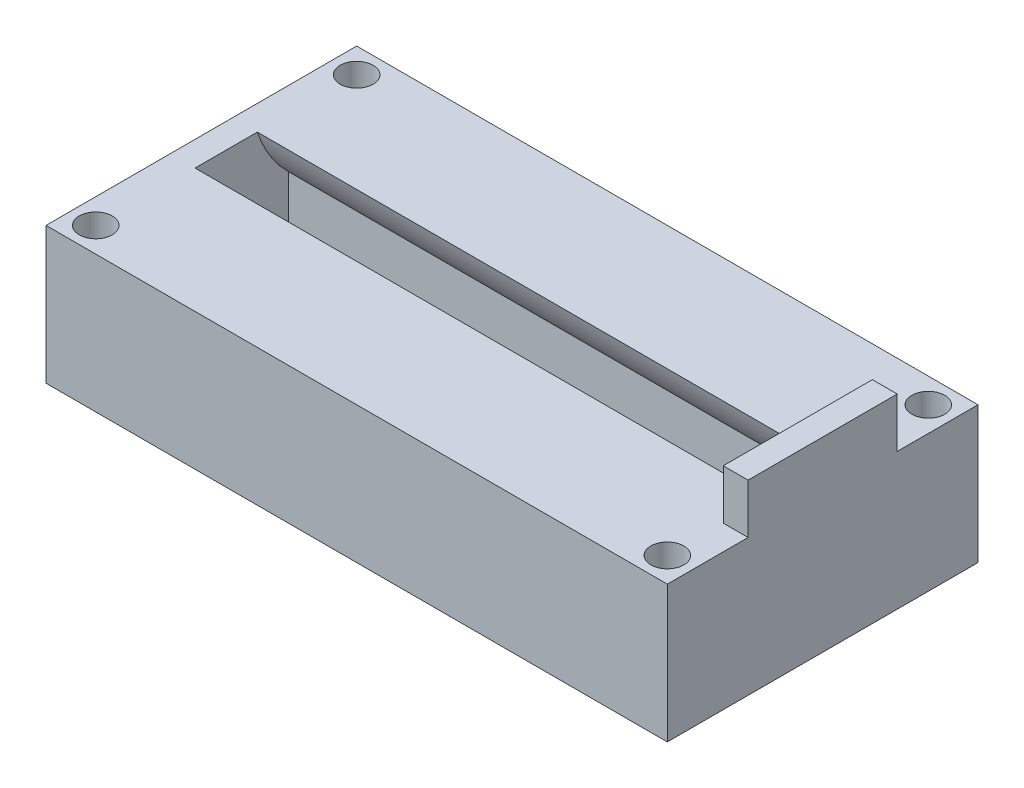
ISO-10303-21;
HEADER;
FILE_DESCRIPTION(('STEP AP214'),'2;1');
FILE_NAME('part.step','',(''),(''),'','','');
FILE_SCHEMA(('AUTOMOTIVE_DESIGN { 1 0 10303 214 1 1 1 1 }'));
ENDSEC;
DATA;
#1=APPLICATION_CONTEXT('core data for automotive mechanical design processes');
#2=APPLICATION_PROTOCOL_DEFINITION('international standard','automotive_design',2000,#1);
#3=PRODUCT_CONTEXT('',#1,'mechanical');
#4=PRODUCT('Part','Part','',(#3));
#5=PRODUCT_RELATED_PRODUCT_CATEGORY('part','',(#4));
#6=PRODUCT_DEFINITION_FORMATION('','',#4);
#7=PRODUCT_DEFINITION_CONTEXT('part definition',#1,'design');
#8=PRODUCT_DEFINITION('design','',#6,#7);
#9=PRODUCT_DEFINITION_SHAPE('','',#8);
#10=(LENGTH_UNIT() NAMED_UNIT(*) SI_UNIT(.MILLI.,.METRE.));
#11=(NAMED_UNIT(*) PLANE_ANGLE_UNIT() SI_UNIT($,.RADIAN.));
#12=(NAMED_UNIT(*) SI_UNIT($,.STERADIAN.) SOLID_ANGLE_UNIT());
#13=UNCERTAINTY_MEASURE_WITH_UNIT(LENGTH_MEASURE(1.E-05),#10,'distance_accuracy_value','');
#14=(GEOMETRIC_REPRESENTATION_CONTEXT(3) GLOBAL_UNCERTAINTY_ASSIGNED_CONTEXT((#13)) GLOBAL_UNIT_ASSIGNED_CONTEXT((#10,
#11,#12)) REPRESENTATION_CONTEXT('',''));
#15=CARTESIAN_POINT('',(0.,0.,0.));
#16=DIRECTION('',(0.,0.,1.));
#17=DIRECTION('',(1.,0.,0.));
#18=AXIS2_PLACEMENT_3D('',#15,#16,#17);
#19=CARTESIAN_POINT('',(0.,0.,0.));
#20=DIRECTION('',(0.,-1.,0.));
#21=DIRECTION('',(0.,0.,-1.));
#22=AXIS2_PLACEMENT_3D('',#19,#20,#21);
#23=PLANE('',#22);
#24=CARTESIAN_POINT('',(20.5,0.,-21.));
#25=DIRECTION('',(0.,-1.,0.));
#26=DIRECTION('',(0.,0.,-1.));
#27=AXIS2_PLACEMENT_3D('',#24,#25,#26);
#28=CIRCLE('',#27,2.);
#29=CARTESIAN_POINT('',(20.5,0.,-19.));
#30=VERTEX_POINT('',#29);
#31=CARTESIAN_POINT('',(20.5,0.,-23.));
#32=VERTEX_POINT('',#31);
#33=EDGE_CURVE('E55',#30,#32,#28,.T.);
#34=ORIENTED_EDGE('',*,*,#33,.F.);
#35=DIRECTION('',(-1.,0.,0.));
#36=VECTOR('',#35,1.);
#37=CARTESIAN_POINT('',(20.5,0.,-19.));
#38=LINE('',#37,#36);
#39=CARTESIAN_POINT('',(29.5,0.,-19.));
#40=VERTEX_POINT('',#39);
#41=EDGE_CURVE('E187',#40,#30,#38,.T.);
#42=ORIENTED_EDGE('',*,*,#41,.F.);
#43=CARTESIAN_POINT('',(29.5,0.,-21.));
#44=DIRECTION('',(0.,-1.,0.));
#45=DIRECTION('',(0.,0.,-1.));
#46=AXIS2_PLACEMENT_3D('',#43,#44,#45);
#47=CIRCLE('',#46,2.);
#48=CARTESIAN_POINT('',(29.5,0.,-23.));
#49=VERTEX_POINT('',#48);
#50=EDGE_CURVE('E191',#49,#40,#47,.T.);
#51=ORIENTED_EDGE('',*,*,#50,.F.);
#52=DIRECTION('',(1.,0.,0.));
#53=VECTOR('',#52,1.);
#54=CARTESIAN_POINT('',(20.5,0.,-23.));
#55=LINE('',#54,#53);
#56=EDGE_CURVE('E200',#32,#49,#55,.T.);
#57=ORIENTED_EDGE('',*,*,#56,.F.);
#58=EDGE_LOOP('',(#34,#42,#51,#57));
#59=FACE_BOUND('',#58,.T.);
#60=CARTESIAN_POINT('',(48.,0.,-2.));
#61=DIRECTION('',(0.,1.,0.));
#62=DIRECTION('',(0.,0.,1.));
#63=AXIS2_PLACEMENT_3D('',#60,#61,#62);
#64=CIRCLE('',#63,1.325);
#65=CARTESIAN_POINT('',(48.,0.,-0.675));
#66=VERTEX_POINT('',#65);
#67=EDGE_CURVE('E294',#66,#66,#64,.T.);
#68=ORIENTED_EDGE('',*,*,#67,.T.);
#69=EDGE_LOOP('',(#68));
#70=FACE_BOUND('',#69,.T.);
#71=CARTESIAN_POINT('',(2.,0.,-23.));
#72=DIRECTION('',(0.,1.,0.));
#73=DIRECTION('',(0.,0.,1.));
#74=AXIS2_PLACEMENT_3D('',#71,#72,#73);
#75=CIRCLE('',#74,1.325);
#76=CARTESIAN_POINT('',(2.,0.,-21.675));
#77=VERTEX_POINT('',#76);
#78=EDGE_CURVE('E302',#77,#77,#75,.T.);
#79=ORIENTED_EDGE('',*,*,#78,.T.);
#80=EDGE_LOOP('',(#79));
#81=FACE_BOUND('',#80,.T.);
#82=DIRECTION('',(0.,0.,1.));
#83=VECTOR('',#82,1.);
#84=CARTESIAN_POINT('',(0.,0.,0.));
#85=LINE('',#84,#83);
#86=CARTESIAN_POINT('',(0.,0.,-25.));
#87=VERTEX_POINT('',#86);
#88=CARTESIAN_POINT('',(0.,0.,0.));
#89=VERTEX_POINT('',#88);
#90=EDGE_CURVE('E344',#87,#89,#85,.T.);
#91=ORIENTED_EDGE('',*,*,#90,.F.);
#92=DIRECTION('',(-1.,0.,0.));
#93=VECTOR('',#92,1.);
#94=CARTESIAN_POINT('',(0.,0.,-25.));
#95=LINE('',#94,#93);
#96=CARTESIAN_POINT('',(50.,0.,-25.));
#97=VERTEX_POINT('',#96);
#98=EDGE_CURVE('E354',#97,#87,#95,.T.);
#99=ORIENTED_EDGE('',*,*,#98,.F.);
#100=DIRECTION('',(0.,0.,-1.));
#101=VECTOR('',#100,1.);
#102=CARTESIAN_POINT('',(50.,0.,0.));
#103=LINE('',#102,#101);
#104=CARTESIAN_POINT('',(50.,0.,0.));
#105=VERTEX_POINT('',#104);
#106=EDGE_CURVE('E351',#105,#97,#103,.T.);
#107=ORIENTED_EDGE('',*,*,#106,.F.);
#108=DIRECTION('',(1.,0.,0.));
#109=VECTOR('',#108,1.);
#110=CARTESIAN_POINT('',(0.,0.,0.));
#111=LINE('',#110,#109);
#112=EDGE_CURVE('E348',#89,#105,#111,.T.);
#113=ORIENTED_EDGE('',*,*,#112,.F.);
#114=EDGE_LOOP('',(#91,#99,#107,#113));
#115=FACE_BOUND('',#114,.T.);
#116=DIRECTION('',(-1.,0.,0.));
#117=VECTOR('',#116,1.);
#118=CARTESIAN_POINT('',(1.99999999999999,0.,-17.5));
#119=LINE('',#118,#117);
#120=CARTESIAN_POINT('',(48.,0.,-17.5));
#121=VERTEX_POINT('',#120);
#122=CARTESIAN_POINT('',(1.99999999999999,0.,-17.5));
#123=VERTEX_POINT('',#122);
#124=EDGE_CURVE('E312',#121,#123,#119,.T.);
#125=ORIENTED_EDGE('',*,*,#124,.T.);
#126=DIRECTION('',(0.,0.,1.));
#127=VECTOR('',#126,1.);
#128=CARTESIAN_POINT('',(1.99999999999999,0.,-17.5));
#129=LINE('',#128,#127);
#130=CARTESIAN_POINT('',(1.99999999999999,0.,-7.5));
#131=VERTEX_POINT('',#130);
#132=EDGE_CURVE('E306',#123,#131,#129,.T.);
#133=ORIENTED_EDGE('',*,*,#132,.T.);
#134=DIRECTION('',(1.,0.,0.));
#135=VECTOR('',#134,1.);
#136=CARTESIAN_POINT('',(1.99999999999999,0.,-7.5));
#137=LINE('',#136,#135);
#138=CARTESIAN_POINT('',(48.,0.,-7.5));
#139=VERTEX_POINT('',#138);
#140=EDGE_CURVE('E320',#131,#139,#137,.T.);
#141=ORIENTED_EDGE('',*,*,#140,.T.);
#142=DIRECTION('',(0.,0.,-1.));
#143=VECTOR('',#142,1.);
#144=CARTESIAN_POINT('',(48.,0.,-17.5));
#145=LINE('',#144,#143);
#146=EDGE_CURVE('E324',#139,#121,#145,.T.);
#147=ORIENTED_EDGE('',*,*,#146,.T.);
#148=EDGE_LOOP('',(#125,#133,#141,#147));
#149=FACE_BOUND('',#148,.T.);
#150=CARTESIAN_POINT('',(48.,0.,-23.));
#151=DIRECTION('',(0.,1.,0.));
#152=DIRECTION('',(0.,0.,1.));
#153=AXIS2_PLACEMENT_3D('',#150,#151,#152);
#154=CIRCLE('',#153,1.325);
#155=CARTESIAN_POINT('',(48.,0.,-21.675));
#156=VERTEX_POINT('',#155);
#157=EDGE_CURVE('E298',#156,#156,#154,.T.);
#158=ORIENTED_EDGE('',*,*,#157,.T.);
#159=EDGE_LOOP('',(#158));
#160=FACE_BOUND('',#159,.T.);
#161=CARTESIAN_POINT('',(2.,0.,-2.));
#162=DIRECTION('',(0.,1.,0.));
#163=DIRECTION('',(0.,0.,1.));
#164=AXIS2_PLACEMENT_3D('',#161,#162,#163);
#165=CIRCLE('',#164,1.325);
#166=CARTESIAN_POINT('',(2.,0.,-0.675));
#167=VERTEX_POINT('',#166);
#168=EDGE_CURVE('E290',#167,#167,#165,.T.);
#169=ORIENTED_EDGE('',*,*,#168,.T.);
#170=EDGE_LOOP('',(#169));
#171=FACE_BOUND('',#170,.T.);
#172=ADVANCED_FACE('F39',(#59,#70,#81,#115,#149,#160,#171),#23,.T.);
#173=CARTESIAN_POINT('',(0.,7.,0.));
#174=DIRECTION('',(1.,0.,0.));
#175=DIRECTION('',(0.,0.,-1.));
#176=AXIS2_PLACEMENT_3D('',#173,#174,#175);
#177=PLANE('',#176);
#178=ORIENTED_EDGE('',*,*,#90,.T.);
#179=DIRECTION('',(0.,-1.,0.));
#180=VECTOR('',#179,1.);
#181=CARTESIAN_POINT('',(0.,7.,0.));
#182=LINE('',#181,#180);
#183=CARTESIAN_POINT('',(0.,11.,0.));
#184=VERTEX_POINT('',#183);
#185=EDGE_CURVE('E369',#184,#89,#182,.T.);
#186=ORIENTED_EDGE('',*,*,#185,.F.);
#187=DIRECTION('',(0.,0.,1.));
#188=VECTOR('',#187,1.);
#189=CARTESIAN_POINT('',(0.,11.,-25.));
#190=LINE('',#189,#188);
#191=CARTESIAN_POINT('',(0.,11.,-25.));
#192=VERTEX_POINT('',#191);
#193=EDGE_CURVE('E278',#192,#184,#190,.T.);
#194=ORIENTED_EDGE('',*,*,#193,.F.);
#195=DIRECTION('',(0.,-1.,0.));
#196=VECTOR('',#195,1.);
#197=CARTESIAN_POINT('',(0.,7.,-25.));
#198=LINE('',#197,#196);
#199=EDGE_CURVE('E357',#192,#87,#198,.T.);
#200=ORIENTED_EDGE('',*,*,#199,.T.);
#201=EDGE_LOOP('',(#178,#186,#194,#200));
#202=FACE_BOUND('',#201,.T.);
#203=ADVANCED_FACE('F441',(#202),#177,.F.);
#204=CARTESIAN_POINT('',(0.,7.,0.));
#205=DIRECTION('',(0.,0.,-1.));
#206=DIRECTION('',(-1.,0.,0.));
#207=AXIS2_PLACEMENT_3D('',#204,#205,#206);
#208=PLANE('',#207);
#209=ORIENTED_EDGE('',*,*,#112,.T.);
#210=DIRECTION('',(0.,-1.,0.));
#211=VECTOR('',#210,1.);
#212=CARTESIAN_POINT('',(50.,7.,0.));
#213=LINE('',#212,#211);
#214=CARTESIAN_POINT('',(50.,11.,0.));
#215=VERTEX_POINT('',#214);
#216=EDGE_CURVE('E365',#215,#105,#213,.T.);
#217=ORIENTED_EDGE('',*,*,#216,.F.);
#218=DIRECTION('',(1.,0.,0.));
#219=VECTOR('',#218,1.);
#220=CARTESIAN_POINT('',(0.,11.,0.));
#221=LINE('',#220,#219);
#222=EDGE_CURVE('E282',#184,#215,#221,.T.);
#223=ORIENTED_EDGE('',*,*,#222,.F.);
#224=ORIENTED_EDGE('',*,*,#185,.T.);
#225=EDGE_LOOP('',(#209,#217,#223,#224));
#226=FACE_BOUND('',#225,.T.);
#227=ADVANCED_FACE('F438',(#226),#208,.F.);
#228=CARTESIAN_POINT('',(50.,7.,0.));
#229=DIRECTION('',(-1.,0.,0.));
#230=DIRECTION('',(0.,0.,1.));
#231=AXIS2_PLACEMENT_3D('',#228,#229,#230);
#232=PLANE('',#231);
#233=ORIENTED_EDGE('',*,*,#106,.T.);
#234=DIRECTION('',(0.,-1.,0.));
#235=VECTOR('',#234,1.);
#236=CARTESIAN_POINT('',(50.,7.,-25.));
#237=LINE('',#236,#235);
#238=CARTESIAN_POINT('',(50.,11.,-25.));
#239=VERTEX_POINT('',#238);
#240=EDGE_CURVE('E361',#239,#97,#237,.T.);
#241=ORIENTED_EDGE('',*,*,#240,.F.);
#242=DIRECTION('',(0.,0.,-1.));
#243=VECTOR('',#242,1.);
#244=CARTESIAN_POINT('',(50.,11.,0.));
#245=LINE('',#244,#243);
#246=CARTESIAN_POINT('',(50.,11.,-18.5));
#247=VERTEX_POINT('',#246);
#248=EDGE_CURVE('E286',#247,#239,#245,.T.);
#249=ORIENTED_EDGE('',*,*,#248,.F.);
#250=DIRECTION('',(0.,-1.,0.));
#251=VECTOR('',#250,1.);
#252=CARTESIAN_POINT('',(50.,15.,-18.5));
#253=LINE('',#252,#251);
#254=CARTESIAN_POINT('',(50.,15.,-18.5));
#255=VERTEX_POINT('',#254);
#256=EDGE_CURVE('E244',#255,#247,#253,.T.);
#257=ORIENTED_EDGE('',*,*,#256,.F.);
#258=DIRECTION('',(0.,0.,-1.));
#259=VECTOR('',#258,1.);
#260=CARTESIAN_POINT('',(50.,15.,-6.5));
#261=LINE('',#260,#259);
#262=CARTESIAN_POINT('',(50.,15.,-6.5));
#263=VERTEX_POINT('',#262);
#264=EDGE_CURVE('E223',#263,#255,#261,.T.);
#265=ORIENTED_EDGE('',*,*,#264,.F.);
#266=DIRECTION('',(0.,-1.,0.));
#267=VECTOR('',#266,1.);
#268=CARTESIAN_POINT('',(50.,15.,-6.5));
#269=LINE('',#268,#267);
#270=CARTESIAN_POINT('',(50.,11.,-6.5));
#271=VERTEX_POINT('',#270);
#272=EDGE_CURVE('E248',#263,#271,#269,.T.);
#273=ORIENTED_EDGE('',*,*,#272,.T.);
#274=EDGE_CURVE('E287',#215,#271,#245,.T.);
#275=ORIENTED_EDGE('',*,*,#274,.F.);
#276=ORIENTED_EDGE('',*,*,#216,.T.);
#277=EDGE_LOOP('',(#233,#241,#249,#257,#265,#273,#275,#276));
#278=FACE_BOUND('',#277,.T.);
#279=ADVANCED_FACE('F425',(#278),#232,.F.);
#280=CARTESIAN_POINT('',(0.,7.,-25.));
#281=DIRECTION('',(0.,0.,1.));
#282=DIRECTION('',(1.,0.,0.));
#283=AXIS2_PLACEMENT_3D('',#280,#281,#282);
#284=PLANE('',#283);
#285=ORIENTED_EDGE('',*,*,#98,.T.);
#286=ORIENTED_EDGE('',*,*,#199,.F.);
#287=DIRECTION('',(-1.,0.,0.));
#288=VECTOR('',#287,1.);
#289=CARTESIAN_POINT('',(50.,11.,-25.));
#290=LINE('',#289,#288);
#291=EDGE_CURVE('E274',#239,#192,#290,.T.);
#292=ORIENTED_EDGE('',*,*,#291,.F.);
#293=ORIENTED_EDGE('',*,*,#240,.T.);
#294=EDGE_LOOP('',(#285,#286,#292,#293));
#295=FACE_BOUND('',#294,.T.);
#296=ADVANCED_FACE('F432',(#295),#284,.F.);
#297=CARTESIAN_POINT('',(1.99999999999999,7.,-17.5));
#298=DIRECTION('',(1.,0.,0.));
#299=DIRECTION('',(0.,0.,-1.));
#300=AXIS2_PLACEMENT_3D('',#297,#298,#299);
#301=PLANE('',#300);
#302=ORIENTED_EDGE('',*,*,#132,.F.);
#303=DIRECTION('',(0.,-1.,0.));
#304=VECTOR('',#303,1.);
#305=CARTESIAN_POINT('',(1.99999999999999,7.,-17.5));
#306=LINE('',#305,#304);
#307=CARTESIAN_POINT('',(1.99999999999999,7.,-17.5));
#308=VERTEX_POINT('',#307);
#309=EDGE_CURVE('E316',#308,#123,#306,.T.);
#310=ORIENTED_EDGE('',*,*,#309,.F.);
#311=CARTESIAN_POINT('',(1.99999999999999,14.1414284285429,-24.5));
#312=DIRECTION('',(1.,0.,0.));
#313=DIRECTION('',(0.,0.,-1.));
#314=AXIS2_PLACEMENT_3D('',#311,#312,#313);
#315=CIRCLE('',#314,10.);
#316=CARTESIAN_POINT('',(1.99999999999999,11.,-15.0062427127958));
#317=VERTEX_POINT('',#316);
#318=EDGE_CURVE('E376',#308,#317,#315,.F.);
#319=ORIENTED_EDGE('',*,*,#318,.T.);
#320=DIRECTION('',(0.,0.,1.));
#321=VECTOR('',#320,1.);
#322=CARTESIAN_POINT('',(1.99999999999999,11.,-14.5));
#323=LINE('',#322,#321);
#324=CARTESIAN_POINT('',(1.99999999999999,11.,-9.99375728720425));
#325=VERTEX_POINT('',#324);
#326=EDGE_CURVE('E62',#317,#325,#323,.T.);
#327=ORIENTED_EDGE('',*,*,#326,.T.);
#328=CARTESIAN_POINT('',(1.99999999999999,14.1414284285429,-0.5));
#329=DIRECTION('',(1.,0.,0.));
#330=DIRECTION('',(0.,0.,-1.));
#331=AXIS2_PLACEMENT_3D('',#328,#329,#330);
#332=CIRCLE('',#331,10.);
#333=CARTESIAN_POINT('',(1.99999999999999,7.,-7.5));
#334=VERTEX_POINT('',#333);
#335=EDGE_CURVE('E11',#325,#334,#332,.F.);
#336=ORIENTED_EDGE('',*,*,#335,.T.);
#337=DIRECTION('',(0.,-1.,0.));
#338=VECTOR('',#337,1.);
#339=CARTESIAN_POINT('',(1.99999999999999,7.,-7.5));
#340=LINE('',#339,#338);
#341=EDGE_CURVE('E340',#334,#131,#340,.T.);
#342=ORIENTED_EDGE('',*,*,#341,.T.);
#343=EDGE_LOOP('',(#302,#310,#319,#327,#336,#342));
#344=FACE_BOUND('',#343,.T.);
#345=ADVANCED_FACE('F401',(#344),#301,.T.);
#346=CARTESIAN_POINT('',(1.99999999999999,7.,-7.5));
#347=DIRECTION('',(0.,0.,-1.));
#348=DIRECTION('',(-1.,0.,0.));
#349=AXIS2_PLACEMENT_3D('',#346,#347,#348);
#350=PLANE('',#349);
#351=ORIENTED_EDGE('',*,*,#140,.F.);
#352=ORIENTED_EDGE('',*,*,#341,.F.);
#353=DIRECTION('',(1.,0.,0.));
#354=VECTOR('',#353,1.);
#355=CARTESIAN_POINT('',(1.99999999999999,7.,-7.5));
#356=LINE('',#355,#354);
#357=CARTESIAN_POINT('',(48.,7.,-7.5));
#358=VERTEX_POINT('',#357);
#359=EDGE_CURVE('E307',#334,#358,#356,.T.);
#360=ORIENTED_EDGE('',*,*,#359,.T.);
#361=DIRECTION('',(0.,-1.,0.));
#362=VECTOR('',#361,1.);
#363=CARTESIAN_POINT('',(48.,7.,-7.5));
#364=LINE('',#363,#362);
#365=EDGE_CURVE('E337',#358,#139,#364,.T.);
#366=ORIENTED_EDGE('',*,*,#365,.T.);
#367=EDGE_LOOP('',(#351,#352,#360,#366));
#368=FACE_BOUND('',#367,.T.);
#369=ADVANCED_FACE('F403',(#368),#350,.T.);
#370=CARTESIAN_POINT('',(48.,7.,-17.5));
#371=DIRECTION('',(-1.,0.,0.));
#372=DIRECTION('',(0.,0.,1.));
#373=AXIS2_PLACEMENT_3D('',#370,#371,#372);
#374=PLANE('',#373);
#375=ORIENTED_EDGE('',*,*,#146,.F.);
#376=ORIENTED_EDGE('',*,*,#365,.F.);
#377=CARTESIAN_POINT('',(48.,14.1414284285429,-0.5));
#378=DIRECTION('',(-1.,0.,0.));
#379=DIRECTION('',(0.,0.,1.));
#380=AXIS2_PLACEMENT_3D('',#377,#378,#379);
#381=CIRCLE('',#380,10.);
#382=CARTESIAN_POINT('',(48.,11.,-9.99375728720422));
#383=VERTEX_POINT('',#382);
#384=EDGE_CURVE('E48',#358,#383,#381,.F.);
#385=ORIENTED_EDGE('',*,*,#384,.T.);
#386=DIRECTION('',(0.,0.,1.));
#387=VECTOR('',#386,1.);
#388=CARTESIAN_POINT('',(48.,11.,-6.5));
#389=LINE('',#388,#387);
#390=CARTESIAN_POINT('',(48.,11.,-6.5));
#391=VERTEX_POINT('',#390);
#392=EDGE_CURVE('E234',#383,#391,#389,.T.);
#393=ORIENTED_EDGE('',*,*,#392,.T.);
#394=DIRECTION('',(0.,-1.,0.));
#395=VECTOR('',#394,1.);
#396=CARTESIAN_POINT('',(48.,15.,-6.5));
#397=LINE('',#396,#395);
#398=CARTESIAN_POINT('',(48.,15.,-6.5));
#399=VERTEX_POINT('',#398);
#400=EDGE_CURVE('E252',#399,#391,#397,.T.);
#401=ORIENTED_EDGE('',*,*,#400,.F.);
#402=DIRECTION('',(0.,0.,1.));
#403=VECTOR('',#402,1.);
#404=CARTESIAN_POINT('',(48.,15.,-6.5));
#405=LINE('',#404,#403);
#406=CARTESIAN_POINT('',(48.,15.,-18.5));
#407=VERTEX_POINT('',#406);
#408=EDGE_CURVE('E215',#407,#399,#405,.T.);
#409=ORIENTED_EDGE('',*,*,#408,.F.);
#410=DIRECTION('',(0.,-1.,0.));
#411=VECTOR('',#410,1.);
#412=CARTESIAN_POINT('',(48.,15.,-18.5));
#413=LINE('',#412,#411);
#414=CARTESIAN_POINT('',(48.,11.,-18.5));
#415=VERTEX_POINT('',#414);
#416=EDGE_CURVE('E229',#407,#415,#413,.T.);
#417=ORIENTED_EDGE('',*,*,#416,.T.);
#418=CARTESIAN_POINT('',(48.,11.,-15.0062427127958));
#419=VERTEX_POINT('',#418);
#420=EDGE_CURVE('E209',#415,#419,#389,.T.);
#421=ORIENTED_EDGE('',*,*,#420,.T.);
#422=CARTESIAN_POINT('',(48.,14.1414284285429,-24.5));
#423=DIRECTION('',(-1.,0.,0.));
#424=DIRECTION('',(0.,0.,1.));
#425=AXIS2_PLACEMENT_3D('',#422,#423,#424);
#426=CIRCLE('',#425,10.);
#427=CARTESIAN_POINT('',(48.,7.,-17.5));
#428=VERTEX_POINT('',#427);
#429=EDGE_CURVE('E379',#419,#428,#426,.F.);
#430=ORIENTED_EDGE('',*,*,#429,.T.);
#431=DIRECTION('',(0.,-1.,0.));
#432=VECTOR('',#431,1.);
#433=CARTESIAN_POINT('',(48.,7.,-17.5));
#434=LINE('',#433,#432);
#435=EDGE_CURVE('E334',#428,#121,#434,.T.);
#436=ORIENTED_EDGE('',*,*,#435,.T.);
#437=EDGE_LOOP('',(#375,#376,#385,#393,#401,#409,#417,#421,#430,#436));
#438=FACE_BOUND('',#437,.T.);
#439=ADVANCED_FACE('F389',(#438),#374,.T.);
#440=CARTESIAN_POINT('',(1.99999999999999,7.,-17.5));
#441=DIRECTION('',(0.,0.,1.));
#442=DIRECTION('',(1.,0.,0.));
#443=AXIS2_PLACEMENT_3D('',#440,#441,#442);
#444=PLANE('',#443);
#445=ORIENTED_EDGE('',*,*,#124,.F.);
#446=ORIENTED_EDGE('',*,*,#435,.F.);
#447=DIRECTION('',(-1.,0.,0.));
#448=VECTOR('',#447,1.);
#449=CARTESIAN_POINT('',(1.99999999999999,7.,-17.5));
#450=LINE('',#449,#448);
#451=EDGE_CURVE('E311',#428,#308,#450,.T.);
#452=ORIENTED_EDGE('',*,*,#451,.T.);
#453=ORIENTED_EDGE('',*,*,#309,.T.);
#454=EDGE_LOOP('',(#445,#446,#452,#453));
#455=FACE_BOUND('',#454,.T.);
#456=ADVANCED_FACE('F409',(#455),#444,.T.);
#457=CARTESIAN_POINT('',(2.,7.,-23.));
#458=DIRECTION('',(0.,-1.,0.));
#459=DIRECTION('',(0.,0.,-1.));
#460=AXIS2_PLACEMENT_3D('',#457,#458,#459);
#461=CYLINDRICAL_SURFACE('',#460,1.325);
#462=ORIENTED_EDGE('',*,*,#78,.F.);
#463=EDGE_LOOP('',(#462));
#464=FACE_BOUND('',#463,.T.);
#465=CARTESIAN_POINT('',(2.,11.,-23.));
#466=DIRECTION('',(0.,1.,0.));
#467=DIRECTION('',(0.,0.,1.));
#468=AXIS2_PLACEMENT_3D('',#465,#466,#467);
#469=CIRCLE('',#468,1.325);
#470=CARTESIAN_POINT('',(2.,11.,-21.675));
#471=VERTEX_POINT('',#470);
#472=EDGE_CURVE('E270',#471,#471,#469,.T.);
#473=ORIENTED_EDGE('',*,*,#472,.T.);
#474=EDGE_LOOP('',(#473));
#475=FACE_BOUND('',#474,.T.);
#476=ADVANCED_FACE('F484',(#464,#475),#461,.F.);
#477=CARTESIAN_POINT('',(48.,7.,-23.));
#478=DIRECTION('',(0.,-1.,0.));
#479=DIRECTION('',(0.,0.,-1.));
#480=AXIS2_PLACEMENT_3D('',#477,#478,#479);
#481=CYLINDRICAL_SURFACE('',#480,1.325);
#482=ORIENTED_EDGE('',*,*,#157,.F.);
#483=EDGE_LOOP('',(#482));
#484=FACE_BOUND('',#483,.T.);
#485=CARTESIAN_POINT('',(48.,11.,-23.));
#486=DIRECTION('',(0.,1.,0.));
#487=DIRECTION('',(0.,0.,1.));
#488=AXIS2_PLACEMENT_3D('',#485,#486,#487);
#489=CIRCLE('',#488,1.325);
#490=CARTESIAN_POINT('',(48.,11.,-21.675));
#491=VERTEX_POINT('',#490);
#492=EDGE_CURVE('E266',#491,#491,#489,.T.);
#493=ORIENTED_EDGE('',*,*,#492,.T.);
#494=EDGE_LOOP('',(#493));
#495=FACE_BOUND('',#494,.T.);
#496=ADVANCED_FACE('F480',(#484,#495),#481,.F.);
#497=CARTESIAN_POINT('',(48.,7.,-2.));
#498=DIRECTION('',(0.,-1.,0.));
#499=DIRECTION('',(0.,0.,-1.));
#500=AXIS2_PLACEMENT_3D('',#497,#498,#499);
#501=CYLINDRICAL_SURFACE('',#500,1.325);
#502=ORIENTED_EDGE('',*,*,#67,.F.);
#503=EDGE_LOOP('',(#502));
#504=FACE_BOUND('',#503,.T.);
#505=CARTESIAN_POINT('',(48.,11.,-2.));
#506=DIRECTION('',(0.,1.,0.));
#507=DIRECTION('',(0.,0.,1.));
#508=AXIS2_PLACEMENT_3D('',#505,#506,#507);
#509=CIRCLE('',#508,1.325);
#510=CARTESIAN_POINT('',(48.,11.,-0.675));
#511=VERTEX_POINT('',#510);
#512=EDGE_CURVE('E262',#511,#511,#509,.T.);
#513=ORIENTED_EDGE('',*,*,#512,.T.);
#514=EDGE_LOOP('',(#513));
#515=FACE_BOUND('',#514,.T.);
#516=ADVANCED_FACE('F476',(#504,#515),#501,.F.);
#517=CARTESIAN_POINT('',(2.,7.,-2.));
#518=DIRECTION('',(0.,-1.,0.));
#519=DIRECTION('',(0.,0.,-1.));
#520=AXIS2_PLACEMENT_3D('',#517,#518,#519);
#521=CYLINDRICAL_SURFACE('',#520,1.325);
#522=ORIENTED_EDGE('',*,*,#168,.F.);
#523=EDGE_LOOP('',(#522));
#524=FACE_BOUND('',#523,.T.);
#525=CARTESIAN_POINT('',(2.,11.,-2.));
#526=DIRECTION('',(0.,1.,0.));
#527=DIRECTION('',(0.,0.,1.));
#528=AXIS2_PLACEMENT_3D('',#525,#526,#527);
#529=CIRCLE('',#528,1.325);
#530=CARTESIAN_POINT('',(2.,11.,-0.675));
#531=VERTEX_POINT('',#530);
#532=EDGE_CURVE('E258',#531,#531,#529,.T.);
#533=ORIENTED_EDGE('',*,*,#532,.T.);
#534=EDGE_LOOP('',(#533));
#535=FACE_BOUND('',#534,.T.);
#536=ADVANCED_FACE('F473',(#524,#535),#521,.F.);
#537=CARTESIAN_POINT('',(0.,11.,0.));
#538=DIRECTION('',(0.,1.,0.));
#539=DIRECTION('',(0.,0.,1.));
#540=AXIS2_PLACEMENT_3D('',#537,#538,#539);
#541=PLANE('',#540);
#542=DIRECTION('',(-1.,0.,0.));
#543=VECTOR('',#542,1.);
#544=CARTESIAN_POINT('',(25.,11.,-9.9937572872042));
#545=LINE('',#544,#543);
#546=EDGE_CURVE('E382',#383,#325,#545,.T.);
#547=ORIENTED_EDGE('',*,*,#546,.T.);
#548=ORIENTED_EDGE('',*,*,#326,.F.);
#549=DIRECTION('',(1.,0.,0.));
#550=VECTOR('',#549,1.);
#551=CARTESIAN_POINT('',(25.,11.,-15.0062427127958));
#552=LINE('',#551,#550);
#553=EDGE_CURVE('E373',#317,#419,#552,.T.);
#554=ORIENTED_EDGE('',*,*,#553,.T.);
#555=ORIENTED_EDGE('',*,*,#420,.F.);
#556=DIRECTION('',(-1.,0.,0.));
#557=VECTOR('',#556,1.);
#558=CARTESIAN_POINT('',(48.,11.,-18.5));
#559=LINE('',#558,#557);
#560=EDGE_CURVE('E220',#247,#415,#559,.T.);
#561=ORIENTED_EDGE('',*,*,#560,.F.);
#562=ORIENTED_EDGE('',*,*,#248,.T.);
#563=ORIENTED_EDGE('',*,*,#291,.T.);
#564=ORIENTED_EDGE('',*,*,#193,.T.);
#565=ORIENTED_EDGE('',*,*,#222,.T.);
#566=ORIENTED_EDGE('',*,*,#274,.T.);
#567=DIRECTION('',(1.,0.,0.));
#568=VECTOR('',#567,1.);
#569=CARTESIAN_POINT('',(48.,11.,-6.5));
#570=LINE('',#569,#568);
#571=EDGE_CURVE('E233',#391,#271,#570,.T.);
#572=ORIENTED_EDGE('',*,*,#571,.F.);
#573=ORIENTED_EDGE('',*,*,#392,.F.);
#574=EDGE_LOOP('',(#547,#548,#554,#555,#561,#562,#563,#564,#565,#566,#572,#573));
#575=FACE_BOUND('',#574,.T.);
#576=ORIENTED_EDGE('',*,*,#512,.F.);
#577=EDGE_LOOP('',(#576));
#578=FACE_BOUND('',#577,.T.);
#579=ORIENTED_EDGE('',*,*,#472,.F.);
#580=EDGE_LOOP('',(#579));
#581=FACE_BOUND('',#580,.T.);
#582=ORIENTED_EDGE('',*,*,#492,.F.);
#583=EDGE_LOOP('',(#582));
#584=FACE_BOUND('',#583,.T.);
#585=ORIENTED_EDGE('',*,*,#532,.F.);
#586=EDGE_LOOP('',(#585));
#587=FACE_BOUND('',#586,.T.);
#588=ADVANCED_FACE('F396',(#575,#578,#581,#584,#587),#541,.T.);
#589=CARTESIAN_POINT('',(48.,15.,-6.5));
#590=DIRECTION('',(0.,0.,-1.));
#591=DIRECTION('',(-1.,0.,0.));
#592=AXIS2_PLACEMENT_3D('',#589,#590,#591);
#593=PLANE('',#592);
#594=ORIENTED_EDGE('',*,*,#571,.T.);
#595=ORIENTED_EDGE('',*,*,#272,.F.);
#596=DIRECTION('',(1.,0.,0.));
#597=VECTOR('',#596,1.);
#598=CARTESIAN_POINT('',(48.,15.,-6.5));
#599=LINE('',#598,#597);
#600=EDGE_CURVE('E219',#399,#263,#599,.T.);
#601=ORIENTED_EDGE('',*,*,#600,.F.);
#602=ORIENTED_EDGE('',*,*,#400,.T.);
#603=EDGE_LOOP('',(#594,#595,#601,#602));
#604=FACE_BOUND('',#603,.T.);
#605=ADVANCED_FACE('F463',(#604),#593,.F.);
#606=CARTESIAN_POINT('',(48.,15.,-18.5));
#607=DIRECTION('',(0.,0.,1.));
#608=DIRECTION('',(1.,0.,0.));
#609=AXIS2_PLACEMENT_3D('',#606,#607,#608);
#610=PLANE('',#609);
#611=ORIENTED_EDGE('',*,*,#560,.T.);
#612=ORIENTED_EDGE('',*,*,#416,.F.);
#613=DIRECTION('',(-1.,0.,0.));
#614=VECTOR('',#613,1.);
#615=CARTESIAN_POINT('',(48.,15.,-18.5));
#616=LINE('',#615,#614);
#617=EDGE_CURVE('E226',#255,#407,#616,.T.);
#618=ORIENTED_EDGE('',*,*,#617,.F.);
#619=ORIENTED_EDGE('',*,*,#256,.T.);
#620=EDGE_LOOP('',(#611,#612,#618,#619));
#621=FACE_BOUND('',#620,.T.);
#622=ADVANCED_FACE('F420',(#621),#610,.F.);
#623=CARTESIAN_POINT('',(0.,15.,0.));
#624=DIRECTION('',(0.,-1.,0.));
#625=DIRECTION('',(0.,0.,-1.));
#626=AXIS2_PLACEMENT_3D('',#623,#624,#625);
#627=PLANE('',#626);
#628=ORIENTED_EDGE('',*,*,#408,.T.);
#629=ORIENTED_EDGE('',*,*,#600,.T.);
#630=ORIENTED_EDGE('',*,*,#264,.T.);
#631=ORIENTED_EDGE('',*,*,#617,.T.);
#632=EDGE_LOOP('',(#628,#629,#630,#631));
#633=FACE_BOUND('',#632,.T.);
#634=ADVANCED_FACE('F453',(#633),#627,.F.);
#635=CARTESIAN_POINT('',(0.,14.1414284285429,-24.5));
#636=DIRECTION('',(1.,0.,0.));
#637=DIRECTION('',(0.,0.,-1.));
#638=AXIS2_PLACEMENT_3D('',#635,#636,#637);
#639=CYLINDRICAL_SURFACE('',#638,10.);
#640=ORIENTED_EDGE('',*,*,#429,.F.);
#641=ORIENTED_EDGE('',*,*,#553,.F.);
#642=ORIENTED_EDGE('',*,*,#318,.F.);
#643=ORIENTED_EDGE('',*,*,#451,.F.);
#644=EDGE_LOOP('',(#640,#641,#642,#643));
#645=FACE_BOUND('',#644,.T.);
#646=ADVANCED_FACE('F414',(#645),#639,.T.);
#647=CARTESIAN_POINT('',(0.,14.1414284285429,-0.5));
#648=DIRECTION('',(-1.,0.,0.));
#649=DIRECTION('',(0.,0.,1.));
#650=AXIS2_PLACEMENT_3D('',#647,#648,#649);
#651=CYLINDRICAL_SURFACE('',#650,10.);
#652=ORIENTED_EDGE('',*,*,#335,.F.);
#653=ORIENTED_EDGE('',*,*,#546,.F.);
#654=ORIENTED_EDGE('',*,*,#384,.F.);
#655=ORIENTED_EDGE('',*,*,#359,.F.);
#656=EDGE_LOOP('',(#652,#653,#654,#655));
#657=FACE_BOUND('',#656,.T.);
#658=ADVANCED_FACE('F41',(#657),#651,.T.);
#659=CARTESIAN_POINT('',(20.5,4.,-21.));
#660=DIRECTION('',(0.,-1.,0.));
#661=DIRECTION('',(0.,0.,-1.));
#662=AXIS2_PLACEMENT_3D('',#659,#660,#661);
#663=CYLINDRICAL_SURFACE('',#662,2.);
#664=ORIENTED_EDGE('',*,*,#33,.T.);
#665=DIRECTION('',(0.,-1.,0.));
#666=VECTOR('',#665,1.);
#667=CARTESIAN_POINT('',(20.5,4.,-23.));
#668=LINE('',#667,#666);
#669=CARTESIAN_POINT('',(20.5,4.,-23.));
#670=VERTEX_POINT('',#669);
#671=EDGE_CURVE('E162',#670,#32,#668,.T.);
#672=ORIENTED_EDGE('',*,*,#671,.F.);
#673=CARTESIAN_POINT('',(20.5,4.,-21.));
#674=DIRECTION('',(0.,-1.,0.));
#675=DIRECTION('',(0.,0.,-1.));
#676=AXIS2_PLACEMENT_3D('',#673,#674,#675);
#677=CIRCLE('',#676,2.);
#678=CARTESIAN_POINT('',(20.5,4.,-19.));
#679=VERTEX_POINT('',#678);
#680=EDGE_CURVE('E166',#679,#670,#677,.T.);
#681=ORIENTED_EDGE('',*,*,#680,.F.);
#682=DIRECTION('',(0.,-1.,0.));
#683=VECTOR('',#682,1.);
#684=CARTESIAN_POINT('',(20.5,4.,-19.));
#685=LINE('',#684,#683);
#686=EDGE_CURVE('E206',#679,#30,#685,.T.);
#687=ORIENTED_EDGE('',*,*,#686,.T.);
#688=EDGE_LOOP('',(#664,#672,#681,#687));
#689=FACE_BOUND('',#688,.T.);
#690=ADVANCED_FACE('F164',(#689),#663,.F.);
#691=CARTESIAN_POINT('',(20.5,4.,-19.));
#692=DIRECTION('',(0.,0.,1.));
#693=DIRECTION('',(1.,0.,0.));
#694=AXIS2_PLACEMENT_3D('',#691,#692,#693);
#695=PLANE('',#694);
#696=ORIENTED_EDGE('',*,*,#41,.T.);
#697=ORIENTED_EDGE('',*,*,#686,.F.);
#698=DIRECTION('',(-1.,0.,0.));
#699=VECTOR('',#698,1.);
#700=CARTESIAN_POINT('',(20.5,4.,-19.));
#701=LINE('',#700,#699);
#702=CARTESIAN_POINT('',(29.5,4.,-19.));
#703=VERTEX_POINT('',#702);
#704=EDGE_CURVE('E173',#703,#679,#701,.T.);
#705=ORIENTED_EDGE('',*,*,#704,.F.);
#706=DIRECTION('',(0.,-1.,0.));
#707=VECTOR('',#706,1.);
#708=CARTESIAN_POINT('',(29.5,4.,-19.));
#709=LINE('',#708,#707);
#710=EDGE_CURVE('E210',#703,#40,#709,.T.);
#711=ORIENTED_EDGE('',*,*,#710,.T.);
#712=EDGE_LOOP('',(#696,#697,#705,#711));
#713=FACE_BOUND('',#712,.T.);
#714=ADVANCED_FACE('F575',(#713),#695,.F.);
#715=CARTESIAN_POINT('',(29.5,4.,-21.));
#716=DIRECTION('',(0.,-1.,0.));
#717=DIRECTION('',(0.,0.,-1.));
#718=AXIS2_PLACEMENT_3D('',#715,#716,#717);
#719=CYLINDRICAL_SURFACE('',#718,2.);
#720=ORIENTED_EDGE('',*,*,#50,.T.);
#721=ORIENTED_EDGE('',*,*,#710,.F.);
#722=CARTESIAN_POINT('',(29.5,4.,-21.));
#723=DIRECTION('',(0.,-1.,0.));
#724=DIRECTION('',(0.,0.,-1.));
#725=AXIS2_PLACEMENT_3D('',#722,#723,#724);
#726=CIRCLE('',#725,2.);
#727=CARTESIAN_POINT('',(29.5,4.,-23.));
#728=VERTEX_POINT('',#727);
#729=EDGE_CURVE('E182',#728,#703,#726,.T.);
#730=ORIENTED_EDGE('',*,*,#729,.F.);
#731=DIRECTION('',(0.,-1.,0.));
#732=VECTOR('',#731,1.);
#733=CARTESIAN_POINT('',(29.5,4.,-23.));
#734=LINE('',#733,#732);
#735=EDGE_CURVE('E172',#728,#49,#734,.T.);
#736=ORIENTED_EDGE('',*,*,#735,.T.);
#737=EDGE_LOOP('',(#720,#721,#730,#736));
#738=FACE_BOUND('',#737,.T.);
#739=ADVANCED_FACE('F582',(#738),#719,.F.);
#740=CARTESIAN_POINT('',(20.5,4.,-23.));
#741=DIRECTION('',(0.,0.,-1.));
#742=DIRECTION('',(-1.,0.,0.));
#743=AXIS2_PLACEMENT_3D('',#740,#741,#742);
#744=PLANE('',#743);
#745=ORIENTED_EDGE('',*,*,#56,.T.);
#746=ORIENTED_EDGE('',*,*,#735,.F.);
#747=DIRECTION('',(1.,0.,0.));
#748=VECTOR('',#747,1.);
#749=CARTESIAN_POINT('',(20.5,4.,-23.));
#750=LINE('',#749,#748);
#751=EDGE_CURVE('E176',#670,#728,#750,.T.);
#752=ORIENTED_EDGE('',*,*,#751,.F.);
#753=ORIENTED_EDGE('',*,*,#671,.T.);
#754=EDGE_LOOP('',(#745,#746,#752,#753));
#755=FACE_BOUND('',#754,.T.);
#756=ADVANCED_FACE('F177',(#755),#744,.F.);
#757=CARTESIAN_POINT('',(20.5,4.,-21.));
#758=DIRECTION('',(0.,-1.,0.));
#759=DIRECTION('',(0.,0.,-1.));
#760=AXIS2_PLACEMENT_3D('',#757,#758,#759);
#761=PLANE('',#760);
#762=ORIENTED_EDGE('',*,*,#680,.T.);
#763=ORIENTED_EDGE('',*,*,#751,.T.);
#764=ORIENTED_EDGE('',*,*,#729,.T.);
#765=ORIENTED_EDGE('',*,*,#704,.T.);
#766=EDGE_LOOP('',(#762,#763,#764,#765));
#767=FACE_BOUND('',#766,.T.);
#768=ADVANCED_FACE('F184',(#767),#761,.T.);
#769=CLOSED_SHELL('',(#172,#203,#227,#279,#296,#345,#369,#439,#456,#476,#496,#516,#536,#588,
#605,#622,#634,#646,#658,#690,#714,#739,#756,#768));
#770=MANIFOLD_SOLID_BREP('B2',#769);
#771=ADVANCED_BREP_SHAPE_REPRESENTATION('',(#18,#770),#14);
#772=SHAPE_DEFINITION_REPRESENTATION(#9,#771);
ENDSEC;
END-ISO-10303-21;
